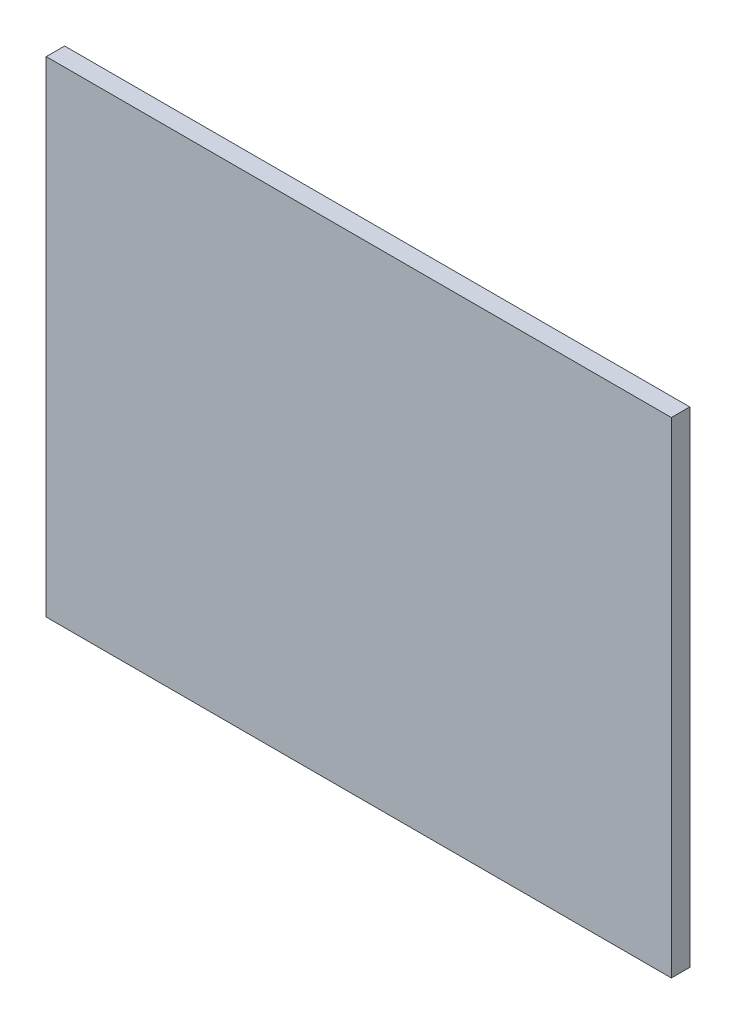
ISO-10303-21;
HEADER;
FILE_DESCRIPTION(('STEP AP214'),'2;1');
FILE_NAME('part.step','',(''),(''),'','','');
FILE_SCHEMA(('AUTOMOTIVE_DESIGN { 1 0 10303 214 1 1 1 1 }'));
ENDSEC;
DATA;
#1=APPLICATION_CONTEXT('core data for automotive mechanical design processes');
#2=APPLICATION_PROTOCOL_DEFINITION('international standard','automotive_design',2000,#1);
#3=PRODUCT_CONTEXT('',#1,'mechanical');
#4=PRODUCT('Part','Part','',(#3));
#5=PRODUCT_RELATED_PRODUCT_CATEGORY('part','',(#4));
#6=PRODUCT_DEFINITION_FORMATION('','',#4);
#7=PRODUCT_DEFINITION_CONTEXT('part definition',#1,'design');
#8=PRODUCT_DEFINITION('design','',#6,#7);
#9=PRODUCT_DEFINITION_SHAPE('','',#8);
#10=(LENGTH_UNIT() NAMED_UNIT(*) SI_UNIT(.MILLI.,.METRE.));
#11=(NAMED_UNIT(*) PLANE_ANGLE_UNIT() SI_UNIT($,.RADIAN.));
#12=(NAMED_UNIT(*) SI_UNIT($,.STERADIAN.) SOLID_ANGLE_UNIT());
#13=UNCERTAINTY_MEASURE_WITH_UNIT(LENGTH_MEASURE(1.E-05),#10,'distance_accuracy_value','');
#14=(GEOMETRIC_REPRESENTATION_CONTEXT(3) GLOBAL_UNCERTAINTY_ASSIGNED_CONTEXT((#13)) GLOBAL_UNIT_ASSIGNED_CONTEXT((#10,
#11,#12)) REPRESENTATION_CONTEXT('',''));
#15=CARTESIAN_POINT('',(0.,0.,0.));
#16=DIRECTION('',(0.,0.,1.));
#17=DIRECTION('',(1.,0.,0.));
#18=AXIS2_PLACEMENT_3D('',#15,#16,#17);
#19=CARTESIAN_POINT('',(-39.4307692307693,36.3846153846154,2.5));
#20=DIRECTION('',(1.,0.,0.));
#21=DIRECTION('',(0.,0.,-1.));
#22=AXIS2_PLACEMENT_3D('',#19,#20,#21);
#23=PLANE('',#22);
#24=DIRECTION('',(0.,-1.,0.));
#25=VECTOR('',#24,1.);
#26=CARTESIAN_POINT('',(-39.4307692307693,36.3846153846154,0.));
#27=LINE('',#26,#25);
#28=CARTESIAN_POINT('',(-39.4307692307693,36.3846153846154,0.));
#29=VERTEX_POINT('',#28);
#30=CARTESIAN_POINT('',(-39.4307692307693,-29.6153846153846,0.));
#31=VERTEX_POINT('',#30);
#32=EDGE_CURVE('E96',#29,#31,#27,.T.);
#33=ORIENTED_EDGE('',*,*,#32,.T.);
#34=DIRECTION('',(0.,0.,-1.));
#35=VECTOR('',#34,1.);
#36=CARTESIAN_POINT('',(-39.4307692307693,-29.6153846153846,2.5));
#37=LINE('',#36,#35);
#38=CARTESIAN_POINT('',(-39.4307692307693,-29.6153846153846,2.5));
#39=VERTEX_POINT('',#38);
#40=EDGE_CURVE('E11',#39,#31,#37,.T.);
#41=ORIENTED_EDGE('',*,*,#40,.F.);
#42=DIRECTION('',(0.,-1.,0.));
#43=VECTOR('',#42,1.);
#44=CARTESIAN_POINT('',(-39.4307692307693,36.3846153846154,2.5));
#45=LINE('',#44,#43);
#46=CARTESIAN_POINT('',(-39.4307692307693,36.3846153846154,2.5));
#47=VERTEX_POINT('',#46);
#48=EDGE_CURVE('E84',#47,#39,#45,.T.);
#49=ORIENTED_EDGE('',*,*,#48,.F.);
#50=DIRECTION('',(0.,0.,-1.));
#51=VECTOR('',#50,1.);
#52=CARTESIAN_POINT('',(-39.4307692307693,36.3846153846154,2.5));
#53=LINE('',#52,#51);
#54=EDGE_CURVE('E92',#47,#29,#53,.T.);
#55=ORIENTED_EDGE('',*,*,#54,.T.);
#56=EDGE_LOOP('',(#33,#41,#49,#55));
#57=FACE_BOUND('',#56,.T.);
#58=ADVANCED_FACE('F33',(#57),#23,.F.);
#59=CARTESIAN_POINT('',(-39.4307692307693,-29.6153846153846,2.5));
#60=DIRECTION('',(0.,1.,0.));
#61=DIRECTION('',(-1.,0.,0.));
#62=AXIS2_PLACEMENT_3D('',#59,#60,#61);
#63=PLANE('',#62);
#64=DIRECTION('',(1.,0.,0.));
#65=VECTOR('',#64,1.);
#66=CARTESIAN_POINT('',(-39.4307692307693,-29.6153846153846,0.));
#67=LINE('',#66,#65);
#68=CARTESIAN_POINT('',(45.5692307692308,-29.6153846153846,0.));
#69=VERTEX_POINT('',#68);
#70=EDGE_CURVE('E88',#31,#69,#67,.T.);
#71=ORIENTED_EDGE('',*,*,#70,.T.);
#72=DIRECTION('',(0.,0.,-1.));
#73=VECTOR('',#72,1.);
#74=CARTESIAN_POINT('',(45.5692307692308,-29.6153846153846,2.5));
#75=LINE('',#74,#73);
#76=CARTESIAN_POINT('',(45.5692307692308,-29.6153846153846,2.5));
#77=VERTEX_POINT('',#76);
#78=EDGE_CURVE('E41',#77,#69,#75,.T.);
#79=ORIENTED_EDGE('',*,*,#78,.F.);
#80=DIRECTION('',(1.,0.,0.));
#81=VECTOR('',#80,1.);
#82=CARTESIAN_POINT('',(-39.4307692307693,-29.6153846153846,2.5));
#83=LINE('',#82,#81);
#84=EDGE_CURVE('E79',#39,#77,#83,.T.);
#85=ORIENTED_EDGE('',*,*,#84,.F.);
#86=ORIENTED_EDGE('',*,*,#40,.T.);
#87=EDGE_LOOP('',(#71,#79,#85,#86));
#88=FACE_BOUND('',#87,.T.);
#89=ADVANCED_FACE('F87',(#88),#63,.F.);
#90=CARTESIAN_POINT('',(45.5692307692308,36.3846153846154,2.5));
#91=DIRECTION('',(-1.,0.,0.));
#92=DIRECTION('',(0.,-1.,0.));
#93=AXIS2_PLACEMENT_3D('',#90,#91,#92);
#94=PLANE('',#93);
#95=DIRECTION('',(0.,1.,0.));
#96=VECTOR('',#95,1.);
#97=CARTESIAN_POINT('',(45.5692307692308,36.3846153846154,0.));
#98=LINE('',#97,#96);
#99=CARTESIAN_POINT('',(45.5692307692308,36.3846153846154,0.));
#100=VERTEX_POINT('',#99);
#101=EDGE_CURVE('E66',#69,#100,#98,.T.);
#102=ORIENTED_EDGE('',*,*,#101,.T.);
#103=DIRECTION('',(0.,0.,-1.));
#104=VECTOR('',#103,1.);
#105=CARTESIAN_POINT('',(45.5692307692308,36.3846153846154,2.5));
#106=LINE('',#105,#104);
#107=CARTESIAN_POINT('',(45.5692307692308,36.3846153846154,2.5));
#108=VERTEX_POINT('',#107);
#109=EDGE_CURVE('E89',#108,#100,#106,.T.);
#110=ORIENTED_EDGE('',*,*,#109,.F.);
#111=DIRECTION('',(0.,1.,0.));
#112=VECTOR('',#111,1.);
#113=CARTESIAN_POINT('',(45.5692307692308,36.3846153846154,2.5));
#114=LINE('',#113,#112);
#115=EDGE_CURVE('E82',#77,#108,#114,.T.);
#116=ORIENTED_EDGE('',*,*,#115,.F.);
#117=ORIENTED_EDGE('',*,*,#78,.T.);
#118=EDGE_LOOP('',(#102,#110,#116,#117));
#119=FACE_BOUND('',#118,.T.);
#120=ADVANCED_FACE('F90',(#119),#94,.F.);
#121=CARTESIAN_POINT('',(-39.4307692307693,36.3846153846154,2.5));
#122=DIRECTION('',(0.,-1.,0.));
#123=DIRECTION('',(0.,0.,-1.));
#124=AXIS2_PLACEMENT_3D('',#121,#122,#123);
#125=PLANE('',#124);
#126=DIRECTION('',(-1.,0.,0.));
#127=VECTOR('',#126,1.);
#128=CARTESIAN_POINT('',(-39.4307692307693,36.3846153846154,0.));
#129=LINE('',#128,#127);
#130=EDGE_CURVE('E72',#100,#29,#129,.T.);
#131=ORIENTED_EDGE('',*,*,#130,.T.);
#132=ORIENTED_EDGE('',*,*,#54,.F.);
#133=DIRECTION('',(-1.,0.,0.));
#134=VECTOR('',#133,1.);
#135=CARTESIAN_POINT('',(-39.4307692307693,36.3846153846154,2.5));
#136=LINE('',#135,#134);
#137=EDGE_CURVE('E49',#108,#47,#136,.T.);
#138=ORIENTED_EDGE('',*,*,#137,.F.);
#139=ORIENTED_EDGE('',*,*,#109,.T.);
#140=EDGE_LOOP('',(#131,#132,#138,#139));
#141=FACE_BOUND('',#140,.T.);
#142=ADVANCED_FACE('F103',(#141),#125,.F.);
#143=CARTESIAN_POINT('',(0.,0.,2.5));
#144=DIRECTION('',(0.,0.,1.));
#145=DIRECTION('',(1.,0.,0.));
#146=AXIS2_PLACEMENT_3D('',#143,#144,#145);
#147=PLANE('',#146);
#148=ORIENTED_EDGE('',*,*,#48,.T.);
#149=ORIENTED_EDGE('',*,*,#84,.T.);
#150=ORIENTED_EDGE('',*,*,#115,.T.);
#151=ORIENTED_EDGE('',*,*,#137,.T.);
#152=EDGE_LOOP('',(#148,#149,#150,#151));
#153=FACE_BOUND('',#152,.T.);
#154=ADVANCED_FACE('F80',(#153),#147,.T.);
#155=CARTESIAN_POINT('',(0.,0.,0.));
#156=DIRECTION('',(0.,0.,1.));
#157=DIRECTION('',(1.,0.,0.));
#158=AXIS2_PLACEMENT_3D('',#155,#156,#157);
#159=PLANE('',#158);
#160=ORIENTED_EDGE('',*,*,#32,.F.);
#161=ORIENTED_EDGE('',*,*,#130,.F.);
#162=ORIENTED_EDGE('',*,*,#101,.F.);
#163=ORIENTED_EDGE('',*,*,#70,.F.);
#164=EDGE_LOOP('',(#160,#161,#162,#163));
#165=FACE_BOUND('',#164,.T.);
#166=ADVANCED_FACE('F106',(#165),#159,.F.);
#167=CLOSED_SHELL('',(#58,#89,#120,#142,#154,#166));
#168=MANIFOLD_SOLID_BREP('B2',#167);
#169=ADVANCED_BREP_SHAPE_REPRESENTATION('',(#18,#168),#14);
#170=SHAPE_DEFINITION_REPRESENTATION(#9,#169);
ENDSEC;
END-ISO-10303-21;
